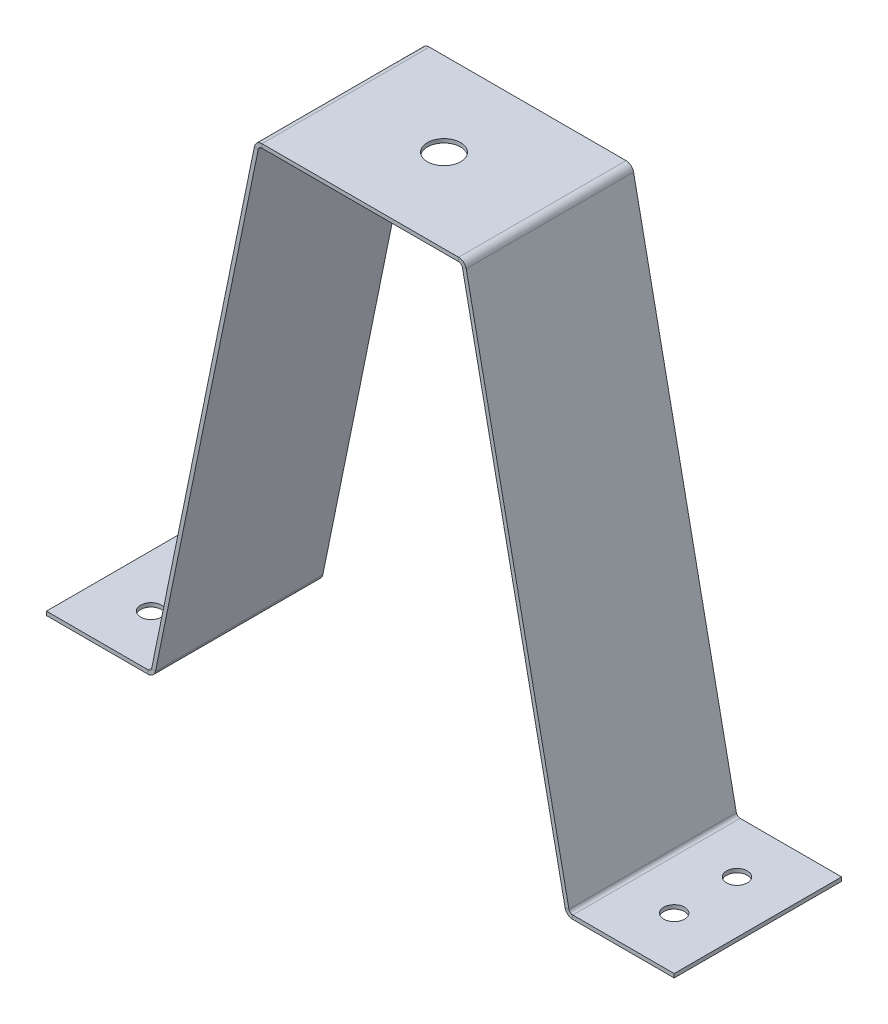
ISO-10303-21;
HEADER;
FILE_DESCRIPTION(('STEP AP214'),'2;1');
FILE_NAME('part.step','',(''),(''),'','','');
FILE_SCHEMA(('AUTOMOTIVE_DESIGN { 1 0 10303 214 1 1 1 1 }'));
ENDSEC;
DATA;
#1=APPLICATION_CONTEXT('core data for automotive mechanical design processes');
#2=APPLICATION_PROTOCOL_DEFINITION('international standard','automotive_design',2000,#1);
#3=PRODUCT_CONTEXT('',#1,'mechanical');
#4=PRODUCT('Part','Part','',(#3));
#5=PRODUCT_RELATED_PRODUCT_CATEGORY('part','',(#4));
#6=PRODUCT_DEFINITION_FORMATION('','',#4);
#7=PRODUCT_DEFINITION_CONTEXT('part definition',#1,'design');
#8=PRODUCT_DEFINITION('design','',#6,#7);
#9=PRODUCT_DEFINITION_SHAPE('','',#8);
#10=(LENGTH_UNIT() NAMED_UNIT(*) SI_UNIT(.MILLI.,.METRE.));
#11=(NAMED_UNIT(*) PLANE_ANGLE_UNIT() SI_UNIT($,.RADIAN.));
#12=(NAMED_UNIT(*) SI_UNIT($,.STERADIAN.) SOLID_ANGLE_UNIT());
#13=UNCERTAINTY_MEASURE_WITH_UNIT(LENGTH_MEASURE(1.E-05),#10,'distance_accuracy_value','');
#14=(GEOMETRIC_REPRESENTATION_CONTEXT(3) GLOBAL_UNCERTAINTY_ASSIGNED_CONTEXT((#13)) GLOBAL_UNIT_ASSIGNED_CONTEXT((#10,
#11,#12)) REPRESENTATION_CONTEXT('',''));
#15=CARTESIAN_POINT('',(0.,0.,0.));
#16=DIRECTION('',(0.,0.,1.));
#17=DIRECTION('',(1.,0.,0.));
#18=AXIS2_PLACEMENT_3D('',#15,#16,#17);
#19=CARTESIAN_POINT('',(-39.8797137236977,0.58928,16.));
#20=DIRECTION('',(0.,0.,1.));
#21=DIRECTION('',(1.,0.,0.));
#22=AXIS2_PLACEMENT_3D('',#19,#20,#21);
#23=PLANE('',#22);
#24=DIRECTION('',(0.979795897113271,-0.200000000000001,0.));
#25=VECTOR('',#24,1.);
#26=CARTESIAN_POINT('',(-39.8797137236977,0.58928,16.));
#27=LINE('',#26,#25);
#28=CARTESIAN_POINT('',(-39.8797137236977,0.58928,16.));
#29=VERTEX_POINT('',#28);
#30=CARTESIAN_POINT('',(-39.1579960658841,0.44196,16.));
#31=VERTEX_POINT('',#30);
#32=EDGE_CURVE('E11',#29,#31,#27,.T.);
#33=ORIENTED_EDGE('',*,*,#32,.F.);
#34=CARTESIAN_POINT('',(-40.6014313815114,0.7366,16.));
#35=DIRECTION('',(0.,0.,-1.));
#36=DIRECTION('',(-1.,0.,0.));
#37=AXIS2_PLACEMENT_3D('',#34,#35,#36);
#38=CIRCLE('',#37,0.7366);
#39=CARTESIAN_POINT('',(-40.6014313815114,0.,16.));
#40=VERTEX_POINT('',#39);
#41=EDGE_CURVE('E404',#40,#29,#38,.F.);
#42=ORIENTED_EDGE('',*,*,#41,.F.);
#43=DIRECTION('',(0.,1.,0.));
#44=VECTOR('',#43,1.);
#45=CARTESIAN_POINT('',(-40.6014313815114,-0.7366,16.));
#46=LINE('',#45,#44);
#47=CARTESIAN_POINT('',(-40.6014313815114,-0.7366,16.));
#48=VERTEX_POINT('',#47);
#49=EDGE_CURVE('E47',#48,#40,#46,.T.);
#50=ORIENTED_EDGE('',*,*,#49,.F.);
#51=CARTESIAN_POINT('',(-40.6014313815114,0.7366,16.));
#52=DIRECTION('',(0.,0.,1.));
#53=DIRECTION('',(1.,0.,0.));
#54=AXIS2_PLACEMENT_3D('',#51,#52,#53);
#55=CIRCLE('',#54,1.4732);
#56=EDGE_CURVE('E416',#48,#31,#55,.T.);
#57=ORIENTED_EDGE('',*,*,#56,.T.);
#58=EDGE_LOOP('',(#33,#42,#50,#57));
#59=FACE_BOUND('',#58,.T.);
#60=ADVANCED_FACE('F38',(#59),#23,.T.);
#61=CARTESIAN_POINT('',(-40.6014313815114,-0.7366,16.));
#62=DIRECTION('',(0.,0.,1.));
#63=DIRECTION('',(1.,0.,0.));
#64=AXIS2_PLACEMENT_3D('',#61,#62,#63);
#65=PLANE('',#64);
#66=DIRECTION('',(0.2,0.979795897113271,0.));
#67=VECTOR('',#66,1.);
#68=CARTESIAN_POINT('',(-40.,0.,16.));
#69=LINE('',#68,#67);
#70=CARTESIAN_POINT('',(-20.2405725526046,96.8010297113271,16.));
#71=VERTEX_POINT('',#70);
#72=EDGE_CURVE('E401',#29,#71,#69,.T.);
#73=ORIENTED_EDGE('',*,*,#72,.F.);
#74=ORIENTED_EDGE('',*,*,#32,.T.);
#75=DIRECTION('',(0.2,0.979795897113271,0.));
#76=VECTOR('',#75,1.);
#77=CARTESIAN_POINT('',(-39.2782823421864,-0.14732,16.));
#78=LINE('',#77,#76);
#79=CARTESIAN_POINT('',(-19.5188548947909,96.6537097113271,16.));
#80=VERTEX_POINT('',#79);
#81=EDGE_CURVE('E419',#31,#80,#78,.T.);
#82=ORIENTED_EDGE('',*,*,#81,.T.);
#83=DIRECTION('',(-0.97979589711327,0.200000000000007,0.));
#84=VECTOR('',#83,1.);
#85=CARTESIAN_POINT('',(-19.5188548947909,96.6537097113271,16.));
#86=LINE('',#85,#84);
#87=EDGE_CURVE('E344',#80,#71,#86,.T.);
#88=ORIENTED_EDGE('',*,*,#87,.T.);
#89=EDGE_LOOP('',(#73,#74,#82,#88));
#90=FACE_BOUND('',#89,.T.);
#91=ADVANCED_FACE('F476',(#90),#65,.T.);
#92=CARTESIAN_POINT('',(-40.6014313815114,0.,-16.));
#93=DIRECTION('',(0.,0.,-1.));
#94=DIRECTION('',(-1.,0.,0.));
#95=AXIS2_PLACEMENT_3D('',#92,#93,#94);
#96=PLANE('',#95);
#97=DIRECTION('',(0.,-1.,0.));
#98=VECTOR('',#97,1.);
#99=CARTESIAN_POINT('',(-40.6014313815114,0.,-16.));
#100=LINE('',#99,#98);
#101=CARTESIAN_POINT('',(-40.6014313815114,0.,-16.));
#102=VERTEX_POINT('',#101);
#103=CARTESIAN_POINT('',(-40.6014313815114,-0.7366,-16.));
#104=VERTEX_POINT('',#103);
#105=EDGE_CURVE('E350',#102,#104,#100,.T.);
#106=ORIENTED_EDGE('',*,*,#105,.F.);
#107=CARTESIAN_POINT('',(-40.6014313815114,0.7366,-16.));
#108=DIRECTION('',(0.,0.,-1.));
#109=DIRECTION('',(-1.,0.,0.));
#110=AXIS2_PLACEMENT_3D('',#107,#108,#109);
#111=CIRCLE('',#110,0.7366);
#112=CARTESIAN_POINT('',(-39.8797137236977,0.58928,-16.));
#113=VERTEX_POINT('',#112);
#114=EDGE_CURVE('E254',#102,#113,#111,.F.);
#115=ORIENTED_EDGE('',*,*,#114,.T.);
#116=DIRECTION('',(-0.979795897113271,0.200000000000001,0.));
#117=VECTOR('',#116,1.);
#118=CARTESIAN_POINT('',(-39.1579960658841,0.44196,-16.));
#119=LINE('',#118,#117);
#120=CARTESIAN_POINT('',(-39.1579960658841,0.44196,-16.));
#121=VERTEX_POINT('',#120);
#122=EDGE_CURVE('E348',#121,#113,#119,.T.);
#123=ORIENTED_EDGE('',*,*,#122,.F.);
#124=CARTESIAN_POINT('',(-40.6014313815114,0.7366,-16.));
#125=DIRECTION('',(0.,0.,1.));
#126=DIRECTION('',(1.,0.,0.));
#127=AXIS2_PLACEMENT_3D('',#124,#125,#126);
#128=CIRCLE('',#127,1.4732);
#129=EDGE_CURVE('E266',#104,#121,#128,.T.);
#130=ORIENTED_EDGE('',*,*,#129,.F.);
#131=EDGE_LOOP('',(#106,#115,#123,#130));
#132=FACE_BOUND('',#131,.T.);
#133=ADVANCED_FACE('F481',(#132),#96,.T.);
#134=CARTESIAN_POINT('',(-39.1579960658841,0.44196,-16.));
#135=DIRECTION('',(0.,0.,-1.));
#136=DIRECTION('',(-1.,0.,0.));
#137=AXIS2_PLACEMENT_3D('',#134,#135,#136);
#138=PLANE('',#137);
#139=DIRECTION('',(1.,0.,0.));
#140=VECTOR('',#139,1.);
#141=CARTESIAN_POINT('',(-60.,0.,-16.));
#142=LINE('',#141,#140);
#143=CARTESIAN_POINT('',(-60.,0.,-16.));
#144=VERTEX_POINT('',#143);
#145=EDGE_CURVE('E257',#144,#102,#142,.T.);
#146=ORIENTED_EDGE('',*,*,#145,.T.);
#147=ORIENTED_EDGE('',*,*,#105,.T.);
#148=DIRECTION('',(1.,0.,0.));
#149=VECTOR('',#148,1.);
#150=CARTESIAN_POINT('',(-60.,-0.7366,-16.));
#151=LINE('',#150,#149);
#152=CARTESIAN_POINT('',(-60.,-0.7366,-16.));
#153=VERTEX_POINT('',#152);
#154=EDGE_CURVE('E263',#153,#104,#151,.T.);
#155=ORIENTED_EDGE('',*,*,#154,.F.);
#156=DIRECTION('',(0.,1.,0.));
#157=VECTOR('',#156,1.);
#158=CARTESIAN_POINT('',(-60.,-0.7366,-16.));
#159=LINE('',#158,#157);
#160=EDGE_CURVE('E260',#153,#144,#159,.T.);
#161=ORIENTED_EDGE('',*,*,#160,.T.);
#162=EDGE_LOOP('',(#146,#147,#155,#161));
#163=FACE_BOUND('',#162,.T.);
#164=ADVANCED_FACE('F537',(#163),#138,.T.);
#165=CARTESIAN_POINT('',(-18.7971372369773,97.9795897113271,16.));
#166=DIRECTION('',(0.,0.,1.));
#167=DIRECTION('',(1.,0.,0.));
#168=AXIS2_PLACEMENT_3D('',#165,#166,#167);
#169=PLANE('',#168);
#170=DIRECTION('',(0.,-1.,0.));
#171=VECTOR('',#170,1.);
#172=CARTESIAN_POINT('',(-18.7971372369773,97.9795897113271,16.));
#173=LINE('',#172,#171);
#174=CARTESIAN_POINT('',(-18.7971372369773,97.9795897113271,16.));
#175=VERTEX_POINT('',#174);
#176=CARTESIAN_POINT('',(-18.7971372369773,97.2429897113271,16.));
#177=VERTEX_POINT('',#176);
#178=EDGE_CURVE('E346',#175,#177,#173,.T.);
#179=ORIENTED_EDGE('',*,*,#178,.F.);
#180=CARTESIAN_POINT('',(-18.7971372369773,96.5063897113271,16.));
#181=DIRECTION('',(0.,0.,1.));
#182=DIRECTION('',(1.,0.,0.));
#183=AXIS2_PLACEMENT_3D('',#180,#181,#182);
#184=CIRCLE('',#183,1.4732);
#185=EDGE_CURVE('E398',#71,#175,#184,.F.);
#186=ORIENTED_EDGE('',*,*,#185,.F.);
#187=ORIENTED_EDGE('',*,*,#87,.F.);
#188=CARTESIAN_POINT('',(-18.7971372369773,96.5063897113271,16.));
#189=DIRECTION('',(0.,0.,1.));
#190=DIRECTION('',(1.,0.,0.));
#191=AXIS2_PLACEMENT_3D('',#188,#189,#190);
#192=CIRCLE('',#191,0.7366);
#193=EDGE_CURVE('E422',#80,#177,#192,.F.);
#194=ORIENTED_EDGE('',*,*,#193,.T.);
#195=EDGE_LOOP('',(#179,#186,#187,#194));
#196=FACE_BOUND('',#195,.T.);
#197=ADVANCED_FACE('F525',(#196),#169,.T.);
#198=CARTESIAN_POINT('',(-19.5188548947909,96.6537097113271,16.));
#199=DIRECTION('',(0.,0.,1.));
#200=DIRECTION('',(1.,0.,0.));
#201=AXIS2_PLACEMENT_3D('',#198,#199,#200);
#202=PLANE('',#201);
#203=DIRECTION('',(1.,0.,0.));
#204=VECTOR('',#203,1.);
#205=CARTESIAN_POINT('',(-20.,97.9795897113271,16.));
#206=LINE('',#205,#204);
#207=CARTESIAN_POINT('',(18.7971372369773,97.9795897113271,16.));
#208=VERTEX_POINT('',#207);
#209=EDGE_CURVE('E395',#175,#208,#206,.T.);
#210=ORIENTED_EDGE('',*,*,#209,.F.);
#211=ORIENTED_EDGE('',*,*,#178,.T.);
#212=DIRECTION('',(1.,0.,0.));
#213=VECTOR('',#212,1.);
#214=CARTESIAN_POINT('',(-20.,97.2429897113271,16.));
#215=LINE('',#214,#213);
#216=CARTESIAN_POINT('',(18.7971372369773,97.2429897113271,16.));
#217=VERTEX_POINT('',#216);
#218=EDGE_CURVE('E207',#177,#217,#215,.T.);
#219=ORIENTED_EDGE('',*,*,#218,.T.);
#220=DIRECTION('',(0.,1.,0.));
#221=VECTOR('',#220,1.);
#222=CARTESIAN_POINT('',(18.7971372369773,97.2429897113271,16.));
#223=LINE('',#222,#221);
#224=EDGE_CURVE('E198',#217,#208,#223,.T.);
#225=ORIENTED_EDGE('',*,*,#224,.T.);
#226=EDGE_LOOP('',(#210,#211,#219,#225));
#227=FACE_BOUND('',#226,.T.);
#228=ADVANCED_FACE('F428',(#227),#202,.T.);
#229=CARTESIAN_POINT('',(-20.2405725526046,96.8010297113271,-16.));
#230=DIRECTION('',(0.,0.,-1.));
#231=DIRECTION('',(-1.,0.,0.));
#232=AXIS2_PLACEMENT_3D('',#229,#230,#231);
#233=PLANE('',#232);
#234=DIRECTION('',(0.97979589711327,-0.200000000000007,0.));
#235=VECTOR('',#234,1.);
#236=CARTESIAN_POINT('',(-20.2405725526046,96.8010297113271,-16.));
#237=LINE('',#236,#235);
#238=CARTESIAN_POINT('',(-20.2405725526046,96.8010297113271,-16.));
#239=VERTEX_POINT('',#238);
#240=CARTESIAN_POINT('',(-19.5188548947909,96.6537097113271,-16.));
#241=VERTEX_POINT('',#240);
#242=EDGE_CURVE('E342',#239,#241,#237,.T.);
#243=ORIENTED_EDGE('',*,*,#242,.F.);
#244=CARTESIAN_POINT('',(-18.7971372369773,96.5063897113271,-16.));
#245=DIRECTION('',(0.,0.,1.));
#246=DIRECTION('',(1.,0.,0.));
#247=AXIS2_PLACEMENT_3D('',#244,#245,#246);
#248=CIRCLE('',#247,1.4732);
#249=CARTESIAN_POINT('',(-18.7971372369773,97.9795897113271,-16.));
#250=VERTEX_POINT('',#249);
#251=EDGE_CURVE('E248',#239,#250,#248,.F.);
#252=ORIENTED_EDGE('',*,*,#251,.T.);
#253=DIRECTION('',(0.,1.,0.));
#254=VECTOR('',#253,1.);
#255=CARTESIAN_POINT('',(-18.7971372369773,97.2429897113271,-16.));
#256=LINE('',#255,#254);
#257=CARTESIAN_POINT('',(-18.7971372369773,97.2429897113271,-16.));
#258=VERTEX_POINT('',#257);
#259=EDGE_CURVE('E197',#258,#250,#256,.T.);
#260=ORIENTED_EDGE('',*,*,#259,.F.);
#261=CARTESIAN_POINT('',(-18.7971372369773,96.5063897113271,-16.));
#262=DIRECTION('',(0.,0.,1.));
#263=DIRECTION('',(1.,0.,0.));
#264=AXIS2_PLACEMENT_3D('',#261,#262,#263);
#265=CIRCLE('',#264,0.7366);
#266=EDGE_CURVE('E272',#241,#258,#265,.F.);
#267=ORIENTED_EDGE('',*,*,#266,.F.);
#268=EDGE_LOOP('',(#243,#252,#260,#267));
#269=FACE_BOUND('',#268,.T.);
#270=ADVANCED_FACE('F549',(#269),#233,.T.);
#271=CARTESIAN_POINT('',(-18.7971372369773,97.2429897113271,-16.));
#272=DIRECTION('',(0.,0.,-1.));
#273=DIRECTION('',(-1.,0.,0.));
#274=AXIS2_PLACEMENT_3D('',#271,#272,#273);
#275=PLANE('',#274);
#276=DIRECTION('',(0.2,0.979795897113271,0.));
#277=VECTOR('',#276,1.);
#278=CARTESIAN_POINT('',(-40.,0.,-16.));
#279=LINE('',#278,#277);
#280=EDGE_CURVE('E251',#113,#239,#279,.T.);
#281=ORIENTED_EDGE('',*,*,#280,.T.);
#282=ORIENTED_EDGE('',*,*,#242,.T.);
#283=DIRECTION('',(0.2,0.979795897113271,0.));
#284=VECTOR('',#283,1.);
#285=CARTESIAN_POINT('',(-39.2782823421864,-0.14732,-16.));
#286=LINE('',#285,#284);
#287=EDGE_CURVE('E269',#121,#241,#286,.T.);
#288=ORIENTED_EDGE('',*,*,#287,.F.);
#289=ORIENTED_EDGE('',*,*,#122,.T.);
#290=EDGE_LOOP('',(#281,#282,#288,#289));
#291=FACE_BOUND('',#290,.T.);
#292=ADVANCED_FACE('F534',(#291),#275,.T.);
#293=CARTESIAN_POINT('',(20.2405725526046,96.8010297113271,16.));
#294=DIRECTION('',(0.,0.,1.));
#295=DIRECTION('',(1.,0.,0.));
#296=AXIS2_PLACEMENT_3D('',#293,#294,#295);
#297=PLANE('',#296);
#298=DIRECTION('',(-0.979795897113273,-0.199999999999991,0.));
#299=VECTOR('',#298,1.);
#300=CARTESIAN_POINT('',(20.2405725526046,96.8010297113271,16.));
#301=LINE('',#300,#299);
#302=CARTESIAN_POINT('',(20.2405725526046,96.8010297113271,16.));
#303=VERTEX_POINT('',#302);
#304=CARTESIAN_POINT('',(19.5188548947909,96.6537097113271,16.));
#305=VERTEX_POINT('',#304);
#306=EDGE_CURVE('E185',#303,#305,#301,.T.);
#307=ORIENTED_EDGE('',*,*,#306,.F.);
#308=CARTESIAN_POINT('',(18.7971372369773,96.5063897113271,16.));
#309=DIRECTION('',(0.,0.,1.));
#310=DIRECTION('',(1.,0.,0.));
#311=AXIS2_PLACEMENT_3D('',#308,#309,#310);
#312=CIRCLE('',#311,1.4732);
#313=EDGE_CURVE('E393',#208,#303,#312,.F.);
#314=ORIENTED_EDGE('',*,*,#313,.F.);
#315=ORIENTED_EDGE('',*,*,#224,.F.);
#316=CARTESIAN_POINT('',(18.7971372369773,96.5063897113271,16.));
#317=DIRECTION('',(0.,0.,1.));
#318=DIRECTION('',(1.,0.,0.));
#319=AXIS2_PLACEMENT_3D('',#316,#317,#318);
#320=CIRCLE('',#319,0.7366);
#321=EDGE_CURVE('E201',#217,#305,#320,.F.);
#322=ORIENTED_EDGE('',*,*,#321,.T.);
#323=EDGE_LOOP('',(#307,#314,#315,#322));
#324=FACE_BOUND('',#323,.T.);
#325=ADVANCED_FACE('F203',(#324),#297,.T.);
#326=CARTESIAN_POINT('',(18.7971372369773,97.2429897113271,16.));
#327=DIRECTION('',(0.,0.,1.));
#328=DIRECTION('',(1.,0.,0.));
#329=AXIS2_PLACEMENT_3D('',#326,#327,#328);
#330=PLANE('',#329);
#331=DIRECTION('',(0.2,-0.979795897113271,0.));
#332=VECTOR('',#331,1.);
#333=CARTESIAN_POINT('',(40.,0.,16.));
#334=LINE('',#333,#332);
#335=CARTESIAN_POINT('',(39.8797137236977,0.589280000000001,16.));
#336=VERTEX_POINT('',#335);
#337=EDGE_CURVE('E192',#303,#336,#334,.T.);
#338=ORIENTED_EDGE('',*,*,#337,.F.);
#339=ORIENTED_EDGE('',*,*,#306,.T.);
#340=DIRECTION('',(0.2,-0.979795897113271,0.));
#341=VECTOR('',#340,1.);
#342=CARTESIAN_POINT('',(39.2782823421863,-0.14732,16.));
#343=LINE('',#342,#341);
#344=CARTESIAN_POINT('',(39.1579960658841,0.44196,16.));
#345=VERTEX_POINT('',#344);
#346=EDGE_CURVE('E189',#305,#345,#343,.T.);
#347=ORIENTED_EDGE('',*,*,#346,.T.);
#348=DIRECTION('',(0.979795897113271,0.2,0.));
#349=VECTOR('',#348,1.);
#350=CARTESIAN_POINT('',(39.1579960658841,0.44196,16.));
#351=LINE('',#350,#349);
#352=EDGE_CURVE('E333',#345,#336,#351,.T.);
#353=ORIENTED_EDGE('',*,*,#352,.T.);
#354=EDGE_LOOP('',(#338,#339,#347,#353));
#355=FACE_BOUND('',#354,.T.);
#356=ADVANCED_FACE('F187',(#355),#330,.T.);
#357=CARTESIAN_POINT('',(18.7971372369773,97.9795897113271,-16.));
#358=DIRECTION('',(0.,0.,-1.));
#359=DIRECTION('',(-1.,0.,0.));
#360=AXIS2_PLACEMENT_3D('',#357,#358,#359);
#361=PLANE('',#360);
#362=DIRECTION('',(0.,-1.,0.));
#363=VECTOR('',#362,1.);
#364=CARTESIAN_POINT('',(18.7971372369773,97.9795897113271,-16.));
#365=LINE('',#364,#363);
#366=CARTESIAN_POINT('',(18.7971372369773,97.9795897113271,-16.));
#367=VERTEX_POINT('',#366);
#368=CARTESIAN_POINT('',(18.7971372369773,97.2429897113271,-16.));
#369=VERTEX_POINT('',#368);
#370=EDGE_CURVE('E338',#367,#369,#365,.T.);
#371=ORIENTED_EDGE('',*,*,#370,.F.);
#372=CARTESIAN_POINT('',(18.7971372369773,96.5063897113271,-16.));
#373=DIRECTION('',(0.,0.,1.));
#374=DIRECTION('',(1.,0.,0.));
#375=AXIS2_PLACEMENT_3D('',#372,#373,#374);
#376=CIRCLE('',#375,1.4732);
#377=CARTESIAN_POINT('',(20.2405725526046,96.8010297113271,-16.));
#378=VERTEX_POINT('',#377);
#379=EDGE_CURVE('E242',#367,#378,#376,.F.);
#380=ORIENTED_EDGE('',*,*,#379,.T.);
#381=DIRECTION('',(0.979795897113273,0.199999999999991,0.));
#382=VECTOR('',#381,1.);
#383=CARTESIAN_POINT('',(19.5188548947909,96.6537097113271,-16.));
#384=LINE('',#383,#382);
#385=CARTESIAN_POINT('',(19.5188548947909,96.6537097113271,-16.));
#386=VERTEX_POINT('',#385);
#387=EDGE_CURVE('E336',#386,#378,#384,.T.);
#388=ORIENTED_EDGE('',*,*,#387,.F.);
#389=CARTESIAN_POINT('',(18.7971372369773,96.5063897113271,-16.));
#390=DIRECTION('',(0.,0.,1.));
#391=DIRECTION('',(1.,0.,0.));
#392=AXIS2_PLACEMENT_3D('',#389,#390,#391);
#393=CIRCLE('',#392,0.7366);
#394=EDGE_CURVE('E214',#369,#386,#393,.F.);
#395=ORIENTED_EDGE('',*,*,#394,.F.);
#396=EDGE_LOOP('',(#371,#380,#388,#395));
#397=FACE_BOUND('',#396,.T.);
#398=ADVANCED_FACE('F434',(#397),#361,.T.);
#399=CARTESIAN_POINT('',(19.5188548947909,96.6537097113271,-16.));
#400=DIRECTION('',(0.,0.,-1.));
#401=DIRECTION('',(-1.,0.,0.));
#402=AXIS2_PLACEMENT_3D('',#399,#400,#401);
#403=PLANE('',#402);
#404=DIRECTION('',(1.,0.,0.));
#405=VECTOR('',#404,1.);
#406=CARTESIAN_POINT('',(-20.,97.9795897113271,-16.));
#407=LINE('',#406,#405);
#408=EDGE_CURVE('E245',#250,#367,#407,.T.);
#409=ORIENTED_EDGE('',*,*,#408,.T.);
#410=ORIENTED_EDGE('',*,*,#370,.T.);
#411=DIRECTION('',(1.,0.,0.));
#412=VECTOR('',#411,1.);
#413=CARTESIAN_POINT('',(-20.,97.2429897113271,-16.));
#414=LINE('',#413,#412);
#415=EDGE_CURVE('E275',#258,#369,#414,.T.);
#416=ORIENTED_EDGE('',*,*,#415,.F.);
#417=ORIENTED_EDGE('',*,*,#259,.T.);
#418=EDGE_LOOP('',(#409,#410,#416,#417));
#419=FACE_BOUND('',#418,.T.);
#420=ADVANCED_FACE('F560',(#419),#403,.T.);
#421=CARTESIAN_POINT('',(40.6014313815113,0.,16.));
#422=DIRECTION('',(0.,0.,1.));
#423=DIRECTION('',(1.,0.,0.));
#424=AXIS2_PLACEMENT_3D('',#421,#422,#423);
#425=PLANE('',#424);
#426=DIRECTION('',(0.,-1.,0.));
#427=VECTOR('',#426,1.);
#428=CARTESIAN_POINT('',(40.6014313815113,0.,16.));
#429=LINE('',#428,#427);
#430=CARTESIAN_POINT('',(40.6014313815113,0.,16.));
#431=VERTEX_POINT('',#430);
#432=CARTESIAN_POINT('',(40.6014313815113,-0.736599999999999,16.));
#433=VERTEX_POINT('',#432);
#434=EDGE_CURVE('E56',#431,#433,#429,.T.);
#435=ORIENTED_EDGE('',*,*,#434,.F.);
#436=CARTESIAN_POINT('',(40.6014313815113,0.736600000000001,16.));
#437=DIRECTION('',(0.,0.,-1.));
#438=DIRECTION('',(-1.,0.,0.));
#439=AXIS2_PLACEMENT_3D('',#436,#437,#438);
#440=CIRCLE('',#439,0.7366);
#441=EDGE_CURVE('E389',#336,#431,#440,.F.);
#442=ORIENTED_EDGE('',*,*,#441,.F.);
#443=ORIENTED_EDGE('',*,*,#352,.F.);
#444=CARTESIAN_POINT('',(40.6014313815113,0.736600000000001,16.));
#445=DIRECTION('',(0.,0.,1.));
#446=DIRECTION('',(1.,0.,0.));
#447=AXIS2_PLACEMENT_3D('',#444,#445,#446);
#448=CIRCLE('',#447,1.4732);
#449=EDGE_CURVE('E222',#345,#433,#448,.T.);
#450=ORIENTED_EDGE('',*,*,#449,.T.);
#451=EDGE_LOOP('',(#435,#442,#443,#450));
#452=FACE_BOUND('',#451,.T.);
#453=ADVANCED_FACE('F563',(#452),#425,.T.);
#454=CARTESIAN_POINT('',(39.1579960658841,0.44196,16.));
#455=DIRECTION('',(0.,0.,1.));
#456=DIRECTION('',(1.,0.,0.));
#457=AXIS2_PLACEMENT_3D('',#454,#455,#456);
#458=PLANE('',#457);
#459=DIRECTION('',(1.,0.,0.));
#460=VECTOR('',#459,1.);
#461=CARTESIAN_POINT('',(60.,0.,16.));
#462=LINE('',#461,#460);
#463=CARTESIAN_POINT('',(60.,0.,16.));
#464=VERTEX_POINT('',#463);
#465=EDGE_CURVE('E386',#431,#464,#462,.T.);
#466=ORIENTED_EDGE('',*,*,#465,.F.);
#467=ORIENTED_EDGE('',*,*,#434,.T.);
#468=DIRECTION('',(1.,0.,0.));
#469=VECTOR('',#468,1.);
#470=CARTESIAN_POINT('',(60.,-0.736599999999985,16.));
#471=LINE('',#470,#469);
#472=CARTESIAN_POINT('',(60.,-0.736599999999985,16.));
#473=VERTEX_POINT('',#472);
#474=EDGE_CURVE('E134',#433,#473,#471,.T.);
#475=ORIENTED_EDGE('',*,*,#474,.T.);
#476=DIRECTION('',(0.,-1.,0.));
#477=VECTOR('',#476,1.);
#478=CARTESIAN_POINT('',(60.,0.,16.));
#479=LINE('',#478,#477);
#480=EDGE_CURVE('E383',#464,#473,#479,.T.);
#481=ORIENTED_EDGE('',*,*,#480,.F.);
#482=EDGE_LOOP('',(#466,#467,#475,#481));
#483=FACE_BOUND('',#482,.T.);
#484=ADVANCED_FACE('F461',(#483),#458,.T.);
#485=CARTESIAN_POINT('',(39.8797137236977,0.589280000000001,-16.));
#486=DIRECTION('',(0.,0.,-1.));
#487=DIRECTION('',(-1.,0.,0.));
#488=AXIS2_PLACEMENT_3D('',#485,#486,#487);
#489=PLANE('',#488);
#490=DIRECTION('',(-0.979795897113271,-0.2,0.));
#491=VECTOR('',#490,1.);
#492=CARTESIAN_POINT('',(39.8797137236977,0.589280000000001,-16.));
#493=LINE('',#492,#491);
#494=CARTESIAN_POINT('',(39.8797137236977,0.589280000000001,-16.));
#495=VERTEX_POINT('',#494);
#496=CARTESIAN_POINT('',(39.1579960658841,0.44196,-16.));
#497=VERTEX_POINT('',#496);
#498=EDGE_CURVE('E121',#495,#497,#493,.T.);
#499=ORIENTED_EDGE('',*,*,#498,.F.);
#500=CARTESIAN_POINT('',(40.6014313815113,0.736600000000001,-16.));
#501=DIRECTION('',(0.,0.,-1.));
#502=DIRECTION('',(-1.,0.,0.));
#503=AXIS2_PLACEMENT_3D('',#500,#501,#502);
#504=CIRCLE('',#503,0.7366);
#505=CARTESIAN_POINT('',(40.6014313815113,0.,-16.));
#506=VERTEX_POINT('',#505);
#507=EDGE_CURVE('E238',#495,#506,#504,.F.);
#508=ORIENTED_EDGE('',*,*,#507,.T.);
#509=DIRECTION('',(0.,1.,0.));
#510=VECTOR('',#509,1.);
#511=CARTESIAN_POINT('',(40.6014313815113,-0.736599999999999,-16.));
#512=LINE('',#511,#510);
#513=CARTESIAN_POINT('',(40.6014313815113,-0.736599999999999,-16.));
#514=VERTEX_POINT('',#513);
#515=EDGE_CURVE('E128',#514,#506,#512,.T.);
#516=ORIENTED_EDGE('',*,*,#515,.F.);
#517=CARTESIAN_POINT('',(40.6014313815113,0.736600000000001,-16.));
#518=DIRECTION('',(0.,0.,1.));
#519=DIRECTION('',(1.,0.,0.));
#520=AXIS2_PLACEMENT_3D('',#517,#518,#519);
#521=CIRCLE('',#520,1.4732);
#522=EDGE_CURVE('E281',#497,#514,#521,.T.);
#523=ORIENTED_EDGE('',*,*,#522,.F.);
#524=EDGE_LOOP('',(#499,#508,#516,#523));
#525=FACE_BOUND('',#524,.T.);
#526=ADVANCED_FACE('F449',(#525),#489,.T.);
#527=CARTESIAN_POINT('',(40.6014313815113,-0.736599999999999,-16.));
#528=DIRECTION('',(0.,0.,-1.));
#529=DIRECTION('',(-1.,0.,0.));
#530=AXIS2_PLACEMENT_3D('',#527,#528,#529);
#531=PLANE('',#530);
#532=DIRECTION('',(0.2,-0.979795897113271,0.));
#533=VECTOR('',#532,1.);
#534=CARTESIAN_POINT('',(40.,0.,-16.));
#535=LINE('',#534,#533);
#536=EDGE_CURVE('E240',#378,#495,#535,.T.);
#537=ORIENTED_EDGE('',*,*,#536,.T.);
#538=ORIENTED_EDGE('',*,*,#498,.T.);
#539=DIRECTION('',(0.2,-0.979795897113271,0.));
#540=VECTOR('',#539,1.);
#541=CARTESIAN_POINT('',(39.2782823421863,-0.14732,-16.));
#542=LINE('',#541,#540);
#543=EDGE_CURVE('E279',#386,#497,#542,.T.);
#544=ORIENTED_EDGE('',*,*,#543,.F.);
#545=ORIENTED_EDGE('',*,*,#387,.T.);
#546=EDGE_LOOP('',(#537,#538,#544,#545));
#547=FACE_BOUND('',#546,.T.);
#548=ADVANCED_FACE('F436',(#547),#531,.T.);
#549=CARTESIAN_POINT('',(60.,-0.736599999999985,16.));
#550=DIRECTION('',(0.,1.,0.));
#551=DIRECTION('',(-1.,0.,0.));
#552=AXIS2_PLACEMENT_3D('',#549,#550,#551);
#553=PLANE('',#552);
#554=CARTESIAN_POINT('',(50.,-0.736600000000004,-6.00000000000002));
#555=DIRECTION('',(0.,1.,0.));
#556=DIRECTION('',(0.,0.,-1.));
#557=AXIS2_PLACEMENT_3D('',#554,#555,#556);
#558=CIRCLE('',#557,1.984375);
#559=CARTESIAN_POINT('',(50.,-0.736600000000004,-7.98437500000001));
#560=VERTEX_POINT('',#559);
#561=EDGE_CURVE('E369',#560,#560,#558,.T.);
#562=ORIENTED_EDGE('',*,*,#561,.T.);
#563=EDGE_LOOP('',(#562));
#564=FACE_BOUND('',#563,.T.);
#565=CARTESIAN_POINT('',(50.,-0.736600000000004,5.99999999999999));
#566=DIRECTION('',(0.,1.,0.));
#567=DIRECTION('',(0.,0.,-1.));
#568=AXIS2_PLACEMENT_3D('',#565,#566,#567);
#569=CIRCLE('',#568,1.984375);
#570=CARTESIAN_POINT('',(50.,-0.736600000000004,4.015625));
#571=VERTEX_POINT('',#570);
#572=EDGE_CURVE('E359',#571,#571,#569,.T.);
#573=ORIENTED_EDGE('',*,*,#572,.T.);
#574=EDGE_LOOP('',(#573));
#575=FACE_BOUND('',#574,.T.);
#576=DIRECTION('',(1.,0.,0.));
#577=VECTOR('',#576,1.);
#578=CARTESIAN_POINT('',(60.,-0.736599999999985,-16.));
#579=LINE('',#578,#577);
#580=CARTESIAN_POINT('',(60.,-0.736599999999985,-16.));
#581=VERTEX_POINT('',#580);
#582=EDGE_CURVE('E228',#514,#581,#579,.T.);
#583=ORIENTED_EDGE('',*,*,#582,.T.);
#584=DIRECTION('',(0.,0.,-1.));
#585=VECTOR('',#584,1.);
#586=CARTESIAN_POINT('',(60.,-0.736599999999985,16.));
#587=LINE('',#586,#585);
#588=EDGE_CURVE('E329',#473,#581,#587,.T.);
#589=ORIENTED_EDGE('',*,*,#588,.F.);
#590=ORIENTED_EDGE('',*,*,#474,.F.);
#591=DIRECTION('',(0.,0.,-1.));
#592=VECTOR('',#591,1.);
#593=CARTESIAN_POINT('',(40.6014313815113,-0.736599999999999,16.));
#594=LINE('',#593,#592);
#595=EDGE_CURVE('E224',#433,#514,#594,.T.);
#596=ORIENTED_EDGE('',*,*,#595,.T.);
#597=EDGE_LOOP('',(#583,#589,#590,#596));
#598=FACE_BOUND('',#597,.T.);
#599=ADVANCED_FACE('F455',(#564,#575,#598),#553,.F.);
#600=CARTESIAN_POINT('',(60.,0.,16.));
#601=DIRECTION('',(1.,0.,0.));
#602=DIRECTION('',(0.,0.,-1.));
#603=AXIS2_PLACEMENT_3D('',#600,#601,#602);
#604=PLANE('',#603);
#605=DIRECTION('',(0.,-1.,0.));
#606=VECTOR('',#605,1.);
#607=CARTESIAN_POINT('',(60.,0.,-16.));
#608=LINE('',#607,#606);
#609=CARTESIAN_POINT('',(60.,0.,-16.));
#610=VERTEX_POINT('',#609);
#611=EDGE_CURVE('E231',#610,#581,#608,.T.);
#612=ORIENTED_EDGE('',*,*,#611,.F.);
#613=DIRECTION('',(0.,0.,-1.));
#614=VECTOR('',#613,1.);
#615=CARTESIAN_POINT('',(60.,0.,16.));
#616=LINE('',#615,#614);
#617=EDGE_CURVE('E327',#464,#610,#616,.T.);
#618=ORIENTED_EDGE('',*,*,#617,.F.);
#619=ORIENTED_EDGE('',*,*,#480,.T.);
#620=ORIENTED_EDGE('',*,*,#588,.T.);
#621=EDGE_LOOP('',(#612,#618,#619,#620));
#622=FACE_BOUND('',#621,.T.);
#623=ADVANCED_FACE('F460',(#622),#604,.T.);
#624=CARTESIAN_POINT('',(60.,0.,16.));
#625=DIRECTION('',(0.,1.,0.));
#626=DIRECTION('',(-1.,0.,0.));
#627=AXIS2_PLACEMENT_3D('',#624,#625,#626);
#628=PLANE('',#627);
#629=CARTESIAN_POINT('',(50.,0.,-6.00000000000002));
#630=DIRECTION('',(0.,1.,0.));
#631=DIRECTION('',(-1.,0.,0.));
#632=AXIS2_PLACEMENT_3D('',#629,#630,#631);
#633=CIRCLE('',#632,1.984375);
#634=CARTESIAN_POINT('',(48.015625,0.,-6.00000000000002));
#635=VERTEX_POINT('',#634);
#636=EDGE_CURVE('E41',#635,#635,#633,.T.);
#637=ORIENTED_EDGE('',*,*,#636,.F.);
#638=EDGE_LOOP('',(#637));
#639=FACE_BOUND('',#638,.T.);
#640=CARTESIAN_POINT('',(50.,0.,5.99999999999999));
#641=DIRECTION('',(0.,1.,0.));
#642=DIRECTION('',(-1.,0.,0.));
#643=AXIS2_PLACEMENT_3D('',#640,#641,#642);
#644=CIRCLE('',#643,1.984375);
#645=CARTESIAN_POINT('',(48.015625,0.,5.99999999999999));
#646=VERTEX_POINT('',#645);
#647=EDGE_CURVE('E357',#646,#646,#644,.T.);
#648=ORIENTED_EDGE('',*,*,#647,.F.);
#649=EDGE_LOOP('',(#648));
#650=FACE_BOUND('',#649,.T.);
#651=DIRECTION('',(1.,0.,0.));
#652=VECTOR('',#651,1.);
#653=CARTESIAN_POINT('',(60.,0.,-16.));
#654=LINE('',#653,#652);
#655=EDGE_CURVE('E235',#506,#610,#654,.T.);
#656=ORIENTED_EDGE('',*,*,#655,.F.);
#657=DIRECTION('',(0.,0.,-1.));
#658=VECTOR('',#657,1.);
#659=CARTESIAN_POINT('',(40.6014313815113,0.,16.));
#660=LINE('',#659,#658);
#661=EDGE_CURVE('E324',#431,#506,#660,.T.);
#662=ORIENTED_EDGE('',*,*,#661,.F.);
#663=ORIENTED_EDGE('',*,*,#465,.T.);
#664=ORIENTED_EDGE('',*,*,#617,.T.);
#665=EDGE_LOOP('',(#656,#662,#663,#664));
#666=FACE_BOUND('',#665,.T.);
#667=ADVANCED_FACE('F463',(#639,#650,#666),#628,.T.);
#668=CARTESIAN_POINT('',(40.6014313815113,0.736600000000001,16.));
#669=DIRECTION('',(0.,0.,-1.));
#670=DIRECTION('',(-1.,0.,0.));
#671=AXIS2_PLACEMENT_3D('',#668,#669,#670);
#672=CYLINDRICAL_SURFACE('',#671,0.7366);
#673=ORIENTED_EDGE('',*,*,#507,.F.);
#674=DIRECTION('',(0.,0.,-1.));
#675=VECTOR('',#674,1.);
#676=CARTESIAN_POINT('',(39.8797137236977,0.589280000000001,16.));
#677=LINE('',#676,#675);
#678=EDGE_CURVE('E321',#336,#495,#677,.T.);
#679=ORIENTED_EDGE('',*,*,#678,.F.);
#680=ORIENTED_EDGE('',*,*,#441,.T.);
#681=ORIENTED_EDGE('',*,*,#661,.T.);
#682=EDGE_LOOP('',(#673,#679,#680,#681));
#683=FACE_BOUND('',#682,.T.);
#684=ADVANCED_FACE('F446',(#683),#672,.F.);
#685=CARTESIAN_POINT('',(40.,0.,16.));
#686=DIRECTION('',(0.979795897113271,0.2,0.));
#687=DIRECTION('',(-0.2,0.979795897113271,0.));
#688=AXIS2_PLACEMENT_3D('',#685,#686,#687);
#689=PLANE('',#688);
#690=ORIENTED_EDGE('',*,*,#536,.F.);
#691=DIRECTION('',(0.,0.,-1.));
#692=VECTOR('',#691,1.);
#693=CARTESIAN_POINT('',(20.2405725526046,96.8010297113271,16.));
#694=LINE('',#693,#692);
#695=EDGE_CURVE('E318',#303,#378,#694,.T.);
#696=ORIENTED_EDGE('',*,*,#695,.F.);
#697=ORIENTED_EDGE('',*,*,#337,.T.);
#698=ORIENTED_EDGE('',*,*,#678,.T.);
#699=EDGE_LOOP('',(#690,#696,#697,#698));
#700=FACE_BOUND('',#699,.T.);
#701=ADVANCED_FACE('F441',(#700),#689,.T.);
#702=CARTESIAN_POINT('',(18.7971372369773,96.5063897113271,16.));
#703=DIRECTION('',(0.,0.,-1.));
#704=DIRECTION('',(-1.,0.,0.));
#705=AXIS2_PLACEMENT_3D('',#702,#703,#704);
#706=CYLINDRICAL_SURFACE('',#705,1.4732);
#707=ORIENTED_EDGE('',*,*,#379,.F.);
#708=DIRECTION('',(0.,0.,-1.));
#709=VECTOR('',#708,1.);
#710=CARTESIAN_POINT('',(18.7971372369773,97.9795897113271,16.));
#711=LINE('',#710,#709);
#712=EDGE_CURVE('E315',#208,#367,#711,.T.);
#713=ORIENTED_EDGE('',*,*,#712,.F.);
#714=ORIENTED_EDGE('',*,*,#313,.T.);
#715=ORIENTED_EDGE('',*,*,#695,.T.);
#716=EDGE_LOOP('',(#707,#713,#714,#715));
#717=FACE_BOUND('',#716,.T.);
#718=ADVANCED_FACE('F439',(#717),#706,.T.);
#719=CARTESIAN_POINT('',(-20.,97.9795897113271,16.));
#720=DIRECTION('',(0.,1.,0.));
#721=DIRECTION('',(0.,0.,1.));
#722=AXIS2_PLACEMENT_3D('',#719,#720,#721);
#723=PLANE('',#722);
#724=CARTESIAN_POINT('',(0.,97.9795897113271,0.));
#725=DIRECTION('',(0.,1.,0.));
#726=DIRECTION('',(0.,0.,1.));
#727=AXIS2_PLACEMENT_3D('',#724,#725,#726);
#728=CIRCLE('',#727,3.175);
#729=CARTESIAN_POINT('',(0.,97.9795897113271,3.175));
#730=VERTEX_POINT('',#729);
#731=EDGE_CURVE('E356',#730,#730,#728,.T.);
#732=ORIENTED_EDGE('',*,*,#731,.F.);
#733=EDGE_LOOP('',(#732));
#734=FACE_BOUND('',#733,.T.);
#735=ORIENTED_EDGE('',*,*,#408,.F.);
#736=DIRECTION('',(0.,0.,-1.));
#737=VECTOR('',#736,1.);
#738=CARTESIAN_POINT('',(-18.7971372369773,97.9795897113271,16.));
#739=LINE('',#738,#737);
#740=EDGE_CURVE('E312',#175,#250,#739,.T.);
#741=ORIENTED_EDGE('',*,*,#740,.F.);
#742=ORIENTED_EDGE('',*,*,#209,.T.);
#743=ORIENTED_EDGE('',*,*,#712,.T.);
#744=EDGE_LOOP('',(#735,#741,#742,#743));
#745=FACE_BOUND('',#744,.T.);
#746=ADVANCED_FACE('F636',(#734,#745),#723,.T.);
#747=CARTESIAN_POINT('',(-18.7971372369773,96.5063897113271,16.));
#748=DIRECTION('',(0.,0.,-1.));
#749=DIRECTION('',(-1.,0.,0.));
#750=AXIS2_PLACEMENT_3D('',#747,#748,#749);
#751=CYLINDRICAL_SURFACE('',#750,1.4732);
#752=ORIENTED_EDGE('',*,*,#251,.F.);
#753=DIRECTION('',(0.,0.,-1.));
#754=VECTOR('',#753,1.);
#755=CARTESIAN_POINT('',(-20.2405725526046,96.8010297113271,16.));
#756=LINE('',#755,#754);
#757=EDGE_CURVE('E309',#71,#239,#756,.T.);
#758=ORIENTED_EDGE('',*,*,#757,.F.);
#759=ORIENTED_EDGE('',*,*,#185,.T.);
#760=ORIENTED_EDGE('',*,*,#740,.T.);
#761=EDGE_LOOP('',(#752,#758,#759,#760));
#762=FACE_BOUND('',#761,.T.);
#763=ADVANCED_FACE('F530',(#762),#751,.T.);
#764=CARTESIAN_POINT('',(-40.,0.,16.));
#765=DIRECTION('',(-0.979795897113271,0.2,0.));
#766=DIRECTION('',(-0.2,-0.979795897113271,0.));
#767=AXIS2_PLACEMENT_3D('',#764,#765,#766);
#768=PLANE('',#767);
#769=ORIENTED_EDGE('',*,*,#280,.F.);
#770=DIRECTION('',(0.,0.,-1.));
#771=VECTOR('',#770,1.);
#772=CARTESIAN_POINT('',(-39.8797137236977,0.58928,16.));
#773=LINE('',#772,#771);
#774=EDGE_CURVE('E306',#29,#113,#773,.T.);
#775=ORIENTED_EDGE('',*,*,#774,.F.);
#776=ORIENTED_EDGE('',*,*,#72,.T.);
#777=ORIENTED_EDGE('',*,*,#757,.T.);
#778=EDGE_LOOP('',(#769,#775,#776,#777));
#779=FACE_BOUND('',#778,.T.);
#780=ADVANCED_FACE('F490',(#779),#768,.T.);
#781=CARTESIAN_POINT('',(-40.6014313815114,0.7366,16.));
#782=DIRECTION('',(0.,0.,-1.));
#783=DIRECTION('',(-1.,0.,0.));
#784=AXIS2_PLACEMENT_3D('',#781,#782,#783);
#785=CYLINDRICAL_SURFACE('',#784,0.7366);
#786=ORIENTED_EDGE('',*,*,#114,.F.);
#787=DIRECTION('',(0.,0.,-1.));
#788=VECTOR('',#787,1.);
#789=CARTESIAN_POINT('',(-40.6014313815114,0.,16.));
#790=LINE('',#789,#788);
#791=EDGE_CURVE('E303',#40,#102,#790,.T.);
#792=ORIENTED_EDGE('',*,*,#791,.F.);
#793=ORIENTED_EDGE('',*,*,#41,.T.);
#794=ORIENTED_EDGE('',*,*,#774,.T.);
#795=EDGE_LOOP('',(#786,#792,#793,#794));
#796=FACE_BOUND('',#795,.T.);
#797=ADVANCED_FACE('F495',(#796),#785,.F.);
#798=CARTESIAN_POINT('',(-60.,0.,16.));
#799=DIRECTION('',(0.,1.,0.));
#800=DIRECTION('',(0.,0.,1.));
#801=AXIS2_PLACEMENT_3D('',#798,#799,#800);
#802=PLANE('',#801);
#803=CARTESIAN_POINT('',(-50.,0.,6.00000000000001));
#804=DIRECTION('',(0.,1.,0.));
#805=DIRECTION('',(0.,0.,1.));
#806=AXIS2_PLACEMENT_3D('',#803,#804,#805);
#807=CIRCLE('',#806,1.984375);
#808=CARTESIAN_POINT('',(-50.,0.,7.984375));
#809=VERTEX_POINT('',#808);
#810=EDGE_CURVE('E374',#809,#809,#807,.T.);
#811=ORIENTED_EDGE('',*,*,#810,.F.);
#812=EDGE_LOOP('',(#811));
#813=FACE_BOUND('',#812,.T.);
#814=CARTESIAN_POINT('',(-50.,0.,-6.00000000000001));
#815=DIRECTION('',(0.,1.,0.));
#816=DIRECTION('',(0.,0.,1.));
#817=AXIS2_PLACEMENT_3D('',#814,#815,#816);
#818=CIRCLE('',#817,1.984375);
#819=CARTESIAN_POINT('',(-50.,0.,-4.01562500000001));
#820=VERTEX_POINT('',#819);
#821=EDGE_CURVE('E232',#820,#820,#818,.T.);
#822=ORIENTED_EDGE('',*,*,#821,.F.);
#823=EDGE_LOOP('',(#822));
#824=FACE_BOUND('',#823,.T.);
#825=ORIENTED_EDGE('',*,*,#145,.F.);
#826=DIRECTION('',(0.,0.,-1.));
#827=VECTOR('',#826,1.);
#828=CARTESIAN_POINT('',(-60.,0.,16.));
#829=LINE('',#828,#827);
#830=CARTESIAN_POINT('',(-60.,0.,16.));
#831=VERTEX_POINT('',#830);
#832=EDGE_CURVE('E301',#831,#144,#829,.T.);
#833=ORIENTED_EDGE('',*,*,#832,.F.);
#834=DIRECTION('',(1.,0.,0.));
#835=VECTOR('',#834,1.);
#836=CARTESIAN_POINT('',(-60.,0.,16.));
#837=LINE('',#836,#835);
#838=EDGE_CURVE('E407',#831,#40,#837,.T.);
#839=ORIENTED_EDGE('',*,*,#838,.T.);
#840=ORIENTED_EDGE('',*,*,#791,.T.);
#841=EDGE_LOOP('',(#825,#833,#839,#840));
#842=FACE_BOUND('',#841,.T.);
#843=ADVANCED_FACE('F498',(#813,#824,#842),#802,.T.);
#844=CARTESIAN_POINT('',(-60.,-0.7366,16.));
#845=DIRECTION('',(-1.,0.,0.));
#846=DIRECTION('',(0.,0.,1.));
#847=AXIS2_PLACEMENT_3D('',#844,#845,#846);
#848=PLANE('',#847);
#849=ORIENTED_EDGE('',*,*,#160,.F.);
#850=DIRECTION('',(0.,0.,-1.));
#851=VECTOR('',#850,1.);
#852=CARTESIAN_POINT('',(-60.,-0.7366,16.));
#853=LINE('',#852,#851);
#854=CARTESIAN_POINT('',(-60.,-0.7366,16.));
#855=VERTEX_POINT('',#854);
#856=EDGE_CURVE('E299',#855,#153,#853,.T.);
#857=ORIENTED_EDGE('',*,*,#856,.F.);
#858=DIRECTION('',(0.,1.,0.));
#859=VECTOR('',#858,1.);
#860=CARTESIAN_POINT('',(-60.,-0.7366,16.));
#861=LINE('',#860,#859);
#862=EDGE_CURVE('E410',#855,#831,#861,.T.);
#863=ORIENTED_EDGE('',*,*,#862,.T.);
#864=ORIENTED_EDGE('',*,*,#832,.T.);
#865=EDGE_LOOP('',(#849,#857,#863,#864));
#866=FACE_BOUND('',#865,.T.);
#867=ADVANCED_FACE('F505',(#866),#848,.T.);
#868=CARTESIAN_POINT('',(-60.,-0.7366,16.));
#869=DIRECTION('',(0.,1.,0.));
#870=DIRECTION('',(0.,0.,1.));
#871=AXIS2_PLACEMENT_3D('',#868,#869,#870);
#872=PLANE('',#871);
#873=CARTESIAN_POINT('',(-50.,-0.736600000000004,6.00000000000001));
#874=DIRECTION('',(0.,1.,0.));
#875=DIRECTION('',(0.,0.,1.));
#876=AXIS2_PLACEMENT_3D('',#873,#874,#875);
#877=CIRCLE('',#876,1.984375);
#878=CARTESIAN_POINT('',(-50.,-0.736600000000004,7.984375));
#879=VERTEX_POINT('',#878);
#880=EDGE_CURVE('E355',#879,#879,#877,.T.);
#881=ORIENTED_EDGE('',*,*,#880,.T.);
#882=EDGE_LOOP('',(#881));
#883=FACE_BOUND('',#882,.T.);
#884=CARTESIAN_POINT('',(-50.,-0.736600000000004,-6.00000000000001));
#885=DIRECTION('',(0.,1.,0.));
#886=DIRECTION('',(0.,0.,1.));
#887=AXIS2_PLACEMENT_3D('',#884,#885,#886);
#888=CIRCLE('',#887,1.984375);
#889=CARTESIAN_POINT('',(-50.,-0.736600000000004,-4.01562500000001));
#890=VERTEX_POINT('',#889);
#891=EDGE_CURVE('E377',#890,#890,#888,.T.);
#892=ORIENTED_EDGE('',*,*,#891,.T.);
#893=EDGE_LOOP('',(#892));
#894=FACE_BOUND('',#893,.T.);
#895=ORIENTED_EDGE('',*,*,#154,.T.);
#896=DIRECTION('',(0.,0.,-1.));
#897=VECTOR('',#896,1.);
#898=CARTESIAN_POINT('',(-40.6014313815114,-0.7366,16.));
#899=LINE('',#898,#897);
#900=EDGE_CURVE('E296',#48,#104,#899,.T.);
#901=ORIENTED_EDGE('',*,*,#900,.F.);
#902=DIRECTION('',(1.,0.,0.));
#903=VECTOR('',#902,1.);
#904=CARTESIAN_POINT('',(-60.,-0.7366,16.));
#905=LINE('',#904,#903);
#906=EDGE_CURVE('E413',#855,#48,#905,.T.);
#907=ORIENTED_EDGE('',*,*,#906,.F.);
#908=ORIENTED_EDGE('',*,*,#856,.T.);
#909=EDGE_LOOP('',(#895,#901,#907,#908));
#910=FACE_BOUND('',#909,.T.);
#911=ADVANCED_FACE('F510',(#883,#894,#910),#872,.F.);
#912=CARTESIAN_POINT('',(-40.6014313815114,0.7366,16.));
#913=DIRECTION('',(0.,0.,-1.));
#914=DIRECTION('',(-1.,0.,0.));
#915=AXIS2_PLACEMENT_3D('',#912,#913,#914);
#916=CYLINDRICAL_SURFACE('',#915,1.4732);
#917=ORIENTED_EDGE('',*,*,#129,.T.);
#918=DIRECTION('',(0.,0.,-1.));
#919=VECTOR('',#918,1.);
#920=CARTESIAN_POINT('',(-39.1579960658841,0.44196,16.));
#921=LINE('',#920,#919);
#922=EDGE_CURVE('E293',#31,#121,#921,.T.);
#923=ORIENTED_EDGE('',*,*,#922,.F.);
#924=ORIENTED_EDGE('',*,*,#56,.F.);
#925=ORIENTED_EDGE('',*,*,#900,.T.);
#926=EDGE_LOOP('',(#917,#923,#924,#925));
#927=FACE_BOUND('',#926,.T.);
#928=ADVANCED_FACE('F513',(#927),#916,.T.);
#929=CARTESIAN_POINT('',(-39.2782823421864,-0.14732,16.));
#930=DIRECTION('',(-0.979795897113271,0.2,0.));
#931=DIRECTION('',(-0.2,-0.979795897113271,0.));
#932=AXIS2_PLACEMENT_3D('',#929,#930,#931);
#933=PLANE('',#932);
#934=ORIENTED_EDGE('',*,*,#287,.T.);
#935=DIRECTION('',(0.,0.,-1.));
#936=VECTOR('',#935,1.);
#937=CARTESIAN_POINT('',(-19.5188548947909,96.6537097113271,16.));
#938=LINE('',#937,#936);
#939=EDGE_CURVE('E290',#80,#241,#938,.T.);
#940=ORIENTED_EDGE('',*,*,#939,.F.);
#941=ORIENTED_EDGE('',*,*,#81,.F.);
#942=ORIENTED_EDGE('',*,*,#922,.T.);
#943=EDGE_LOOP('',(#934,#940,#941,#942));
#944=FACE_BOUND('',#943,.T.);
#945=ADVANCED_FACE('F518',(#944),#933,.F.);
#946=CARTESIAN_POINT('',(-18.7971372369773,96.5063897113271,16.));
#947=DIRECTION('',(0.,0.,-1.));
#948=DIRECTION('',(-1.,0.,0.));
#949=AXIS2_PLACEMENT_3D('',#946,#947,#948);
#950=CYLINDRICAL_SURFACE('',#949,0.7366);
#951=ORIENTED_EDGE('',*,*,#266,.T.);
#952=DIRECTION('',(0.,0.,-1.));
#953=VECTOR('',#952,1.);
#954=CARTESIAN_POINT('',(-18.7971372369773,97.2429897113271,16.));
#955=LINE('',#954,#953);
#956=EDGE_CURVE('E287',#177,#258,#955,.T.);
#957=ORIENTED_EDGE('',*,*,#956,.F.);
#958=ORIENTED_EDGE('',*,*,#193,.F.);
#959=ORIENTED_EDGE('',*,*,#939,.T.);
#960=EDGE_LOOP('',(#951,#957,#958,#959));
#961=FACE_BOUND('',#960,.T.);
#962=ADVANCED_FACE('F523',(#961),#950,.F.);
#963=CARTESIAN_POINT('',(-20.,97.2429897113271,16.));
#964=DIRECTION('',(0.,1.,0.));
#965=DIRECTION('',(0.,0.,1.));
#966=AXIS2_PLACEMENT_3D('',#963,#964,#965);
#967=PLANE('',#966);
#968=CARTESIAN_POINT('',(0.,97.2429897113271,0.));
#969=DIRECTION('',(0.,1.,0.));
#970=DIRECTION('',(0.,0.,1.));
#971=AXIS2_PLACEMENT_3D('',#968,#969,#970);
#972=CIRCLE('',#971,3.175);
#973=CARTESIAN_POINT('',(0.,97.2429897113271,3.175));
#974=VERTEX_POINT('',#973);
#975=EDGE_CURVE('E353',#974,#974,#972,.T.);
#976=ORIENTED_EDGE('',*,*,#975,.T.);
#977=EDGE_LOOP('',(#976));
#978=FACE_BOUND('',#977,.T.);
#979=ORIENTED_EDGE('',*,*,#415,.T.);
#980=DIRECTION('',(0.,0.,-1.));
#981=VECTOR('',#980,1.);
#982=CARTESIAN_POINT('',(18.7971372369773,97.2429897113271,16.));
#983=LINE('',#982,#981);
#984=EDGE_CURVE('E216',#217,#369,#983,.T.);
#985=ORIENTED_EDGE('',*,*,#984,.F.);
#986=ORIENTED_EDGE('',*,*,#218,.F.);
#987=ORIENTED_EDGE('',*,*,#956,.T.);
#988=EDGE_LOOP('',(#979,#985,#986,#987));
#989=FACE_BOUND('',#988,.T.);
#990=ADVANCED_FACE('F431',(#978,#989),#967,.F.);
#991=CARTESIAN_POINT('',(18.7971372369773,96.5063897113271,16.));
#992=DIRECTION('',(0.,0.,-1.));
#993=DIRECTION('',(-1.,0.,0.));
#994=AXIS2_PLACEMENT_3D('',#991,#992,#993);
#995=CYLINDRICAL_SURFACE('',#994,0.7366);
#996=ORIENTED_EDGE('',*,*,#394,.T.);
#997=DIRECTION('',(0.,0.,-1.));
#998=VECTOR('',#997,1.);
#999=CARTESIAN_POINT('',(19.5188548947909,96.6537097113271,16.));
#1000=LINE('',#999,#998);
#1001=EDGE_CURVE('E211',#305,#386,#1000,.T.);
#1002=ORIENTED_EDGE('',*,*,#1001,.F.);
#1003=ORIENTED_EDGE('',*,*,#321,.F.);
#1004=ORIENTED_EDGE('',*,*,#984,.T.);
#1005=EDGE_LOOP('',(#996,#1002,#1003,#1004));
#1006=FACE_BOUND('',#1005,.T.);
#1007=ADVANCED_FACE('F212',(#1006),#995,.F.);
#1008=CARTESIAN_POINT('',(39.2782823421863,-0.14732,16.));
#1009=DIRECTION('',(0.979795897113271,0.2,0.));
#1010=DIRECTION('',(-0.2,0.979795897113271,0.));
#1011=AXIS2_PLACEMENT_3D('',#1008,#1009,#1010);
#1012=PLANE('',#1011);
#1013=ORIENTED_EDGE('',*,*,#543,.T.);
#1014=DIRECTION('',(0.,0.,-1.));
#1015=VECTOR('',#1014,1.);
#1016=CARTESIAN_POINT('',(39.1579960658841,0.44196,16.));
#1017=LINE('',#1016,#1015);
#1018=EDGE_CURVE('E217',#345,#497,#1017,.T.);
#1019=ORIENTED_EDGE('',*,*,#1018,.F.);
#1020=ORIENTED_EDGE('',*,*,#346,.F.);
#1021=ORIENTED_EDGE('',*,*,#1001,.T.);
#1022=EDGE_LOOP('',(#1013,#1019,#1020,#1021));
#1023=FACE_BOUND('',#1022,.T.);
#1024=ADVANCED_FACE('F219',(#1023),#1012,.F.);
#1025=CARTESIAN_POINT('',(40.6014313815113,0.736600000000001,16.));
#1026=DIRECTION('',(0.,0.,-1.));
#1027=DIRECTION('',(-1.,0.,0.));
#1028=AXIS2_PLACEMENT_3D('',#1025,#1026,#1027);
#1029=CYLINDRICAL_SURFACE('',#1028,1.4732);
#1030=ORIENTED_EDGE('',*,*,#522,.T.);
#1031=ORIENTED_EDGE('',*,*,#595,.F.);
#1032=ORIENTED_EDGE('',*,*,#449,.F.);
#1033=ORIENTED_EDGE('',*,*,#1018,.T.);
#1034=EDGE_LOOP('',(#1030,#1031,#1032,#1033));
#1035=FACE_BOUND('',#1034,.T.);
#1036=ADVANCED_FACE('F452',(#1035),#1029,.T.);
#1037=CARTESIAN_POINT('',(40.6014313815113,0.736600000000001,16.));
#1038=DIRECTION('',(0.,0.,-1.));
#1039=DIRECTION('',(-1.,0.,0.));
#1040=AXIS2_PLACEMENT_3D('',#1037,#1038,#1039);
#1041=PLANE('',#1040);
#1042=ORIENTED_EDGE('',*,*,#906,.T.);
#1043=ORIENTED_EDGE('',*,*,#49,.T.);
#1044=ORIENTED_EDGE('',*,*,#838,.F.);
#1045=ORIENTED_EDGE('',*,*,#862,.F.);
#1046=EDGE_LOOP('',(#1042,#1043,#1044,#1045));
#1047=FACE_BOUND('',#1046,.T.);
#1048=ADVANCED_FACE('F502',(#1047),#1041,.F.);
#1049=CARTESIAN_POINT('',(40.6014313815113,0.736600000000001,-16.));
#1050=DIRECTION('',(0.,0.,-1.));
#1051=DIRECTION('',(-1.,0.,0.));
#1052=AXIS2_PLACEMENT_3D('',#1049,#1050,#1051);
#1053=PLANE('',#1052);
#1054=ORIENTED_EDGE('',*,*,#582,.F.);
#1055=ORIENTED_EDGE('',*,*,#515,.T.);
#1056=ORIENTED_EDGE('',*,*,#655,.T.);
#1057=ORIENTED_EDGE('',*,*,#611,.T.);
#1058=EDGE_LOOP('',(#1054,#1055,#1056,#1057));
#1059=FACE_BOUND('',#1058,.T.);
#1060=ADVANCED_FACE('F457',(#1059),#1053,.T.);
#1061=CARTESIAN_POINT('',(-50.,-0.736600000000004,-6.00000000000001));
#1062=DIRECTION('',(0.,1.,0.));
#1063=DIRECTION('',(0.,0.,1.));
#1064=AXIS2_PLACEMENT_3D('',#1061,#1062,#1063);
#1065=CYLINDRICAL_SURFACE('',#1064,1.984375);
#1066=ORIENTED_EDGE('',*,*,#821,.T.);
#1067=EDGE_LOOP('',(#1066));
#1068=FACE_BOUND('',#1067,.T.);
#1069=ORIENTED_EDGE('',*,*,#891,.F.);
#1070=EDGE_LOOP('',(#1069));
#1071=FACE_BOUND('',#1070,.T.);
#1072=ADVANCED_FACE('F598',(#1068,#1071),#1065,.F.);
#1073=CARTESIAN_POINT('',(-50.,-0.736600000000004,6.00000000000001));
#1074=DIRECTION('',(0.,1.,0.));
#1075=DIRECTION('',(0.,0.,1.));
#1076=AXIS2_PLACEMENT_3D('',#1073,#1074,#1075);
#1077=CYLINDRICAL_SURFACE('',#1076,1.984375);
#1078=ORIENTED_EDGE('',*,*,#810,.T.);
#1079=EDGE_LOOP('',(#1078));
#1080=FACE_BOUND('',#1079,.T.);
#1081=ORIENTED_EDGE('',*,*,#880,.F.);
#1082=EDGE_LOOP('',(#1081));
#1083=FACE_BOUND('',#1082,.T.);
#1084=ADVANCED_FACE('F594',(#1080,#1083),#1077,.F.);
#1085=CARTESIAN_POINT('',(0.,-0.736600000000004,0.));
#1086=DIRECTION('',(0.,1.,0.));
#1087=DIRECTION('',(0.,0.,1.));
#1088=AXIS2_PLACEMENT_3D('',#1085,#1086,#1087);
#1089=CYLINDRICAL_SURFACE('',#1088,3.175);
#1090=ORIENTED_EDGE('',*,*,#731,.T.);
#1091=EDGE_LOOP('',(#1090));
#1092=FACE_BOUND('',#1091,.T.);
#1093=ORIENTED_EDGE('',*,*,#975,.F.);
#1094=EDGE_LOOP('',(#1093));
#1095=FACE_BOUND('',#1094,.T.);
#1096=ADVANCED_FACE('F589',(#1092,#1095),#1089,.F.);
#1097=CARTESIAN_POINT('',(50.,-0.736600000000004,5.99999999999999));
#1098=DIRECTION('',(0.,1.,0.));
#1099=DIRECTION('',(0.,0.,1.));
#1100=AXIS2_PLACEMENT_3D('',#1097,#1098,#1099);
#1101=CYLINDRICAL_SURFACE('',#1100,1.984375);
#1102=ORIENTED_EDGE('',*,*,#647,.T.);
#1103=EDGE_LOOP('',(#1102));
#1104=FACE_BOUND('',#1103,.T.);
#1105=ORIENTED_EDGE('',*,*,#572,.F.);
#1106=EDGE_LOOP('',(#1105));
#1107=FACE_BOUND('',#1106,.T.);
#1108=ADVANCED_FACE('F583',(#1104,#1107),#1101,.F.);
#1109=CARTESIAN_POINT('',(50.,-0.736600000000004,-6.00000000000002));
#1110=DIRECTION('',(0.,1.,0.));
#1111=DIRECTION('',(0.,0.,1.));
#1112=AXIS2_PLACEMENT_3D('',#1109,#1110,#1111);
#1113=CYLINDRICAL_SURFACE('',#1112,1.984375);
#1114=ORIENTED_EDGE('',*,*,#636,.T.);
#1115=EDGE_LOOP('',(#1114));
#1116=FACE_BOUND('',#1115,.T.);
#1117=ORIENTED_EDGE('',*,*,#561,.F.);
#1118=EDGE_LOOP('',(#1117));
#1119=FACE_BOUND('',#1118,.T.);
#1120=ADVANCED_FACE('F581',(#1116,#1119),#1113,.F.);
#1121=CLOSED_SHELL('',(#60,#91,#133,#164,#197,#228,#270,#292,#325,#356,#398,#420,#453,#484,#526,
#548,#599,#623,#667,#684,#701,#718,#746,#763,#780,#797,#843,#867,#911,#928,#945,#962,#990,#1007,
#1024,#1036,#1048,#1060,#1072,#1084,#1096,#1108,#1120));
#1122=MANIFOLD_SOLID_BREP('B2',#1121);
#1123=ADVANCED_BREP_SHAPE_REPRESENTATION('',(#18,#1122),#14);
#1124=SHAPE_DEFINITION_REPRESENTATION(#9,#1123);
ENDSEC;
END-ISO-10303-21;
